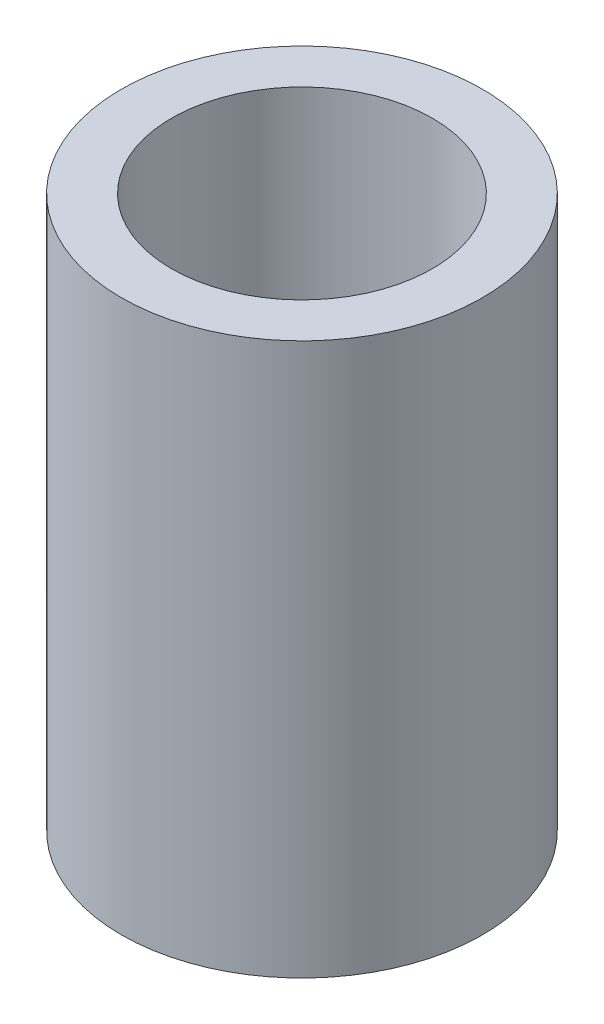
ISO-10303-21;
HEADER;
FILE_DESCRIPTION(('STEP AP214'),'2;1');
FILE_NAME('part.step','',(''),(''),'','','');
FILE_SCHEMA(('AUTOMOTIVE_DESIGN { 1 0 10303 214 1 1 1 1 }'));
ENDSEC;
DATA;
#1=APPLICATION_CONTEXT('core data for automotive mechanical design processes');
#2=APPLICATION_PROTOCOL_DEFINITION('international standard','automotive_design',2000,#1);
#3=PRODUCT_CONTEXT('',#1,'mechanical');
#4=PRODUCT('Part','Part','',(#3));
#5=PRODUCT_RELATED_PRODUCT_CATEGORY('part','',(#4));
#6=PRODUCT_DEFINITION_FORMATION('','',#4);
#7=PRODUCT_DEFINITION_CONTEXT('part definition',#1,'design');
#8=PRODUCT_DEFINITION('design','',#6,#7);
#9=PRODUCT_DEFINITION_SHAPE('','',#8);
#10=(LENGTH_UNIT() NAMED_UNIT(*) SI_UNIT(.MILLI.,.METRE.));
#11=(NAMED_UNIT(*) PLANE_ANGLE_UNIT() SI_UNIT($,.RADIAN.));
#12=(NAMED_UNIT(*) SI_UNIT($,.STERADIAN.) SOLID_ANGLE_UNIT());
#13=UNCERTAINTY_MEASURE_WITH_UNIT(LENGTH_MEASURE(1.E-05),#10,'distance_accuracy_value','');
#14=(GEOMETRIC_REPRESENTATION_CONTEXT(3) GLOBAL_UNCERTAINTY_ASSIGNED_CONTEXT((#13)) GLOBAL_UNIT_ASSIGNED_CONTEXT((#10,
#11,#12)) REPRESENTATION_CONTEXT('',''));
#15=CARTESIAN_POINT('',(0.,0.,0.));
#16=DIRECTION('',(0.,0.,1.));
#17=DIRECTION('',(1.,0.,0.));
#18=AXIS2_PLACEMENT_3D('',#15,#16,#17);
#19=CARTESIAN_POINT('',(0.,-15.,0.));
#20=DIRECTION('',(0.,1.,0.));
#21=DIRECTION('',(0.,0.,1.));
#22=AXIS2_PLACEMENT_3D('',#19,#20,#21);
#23=CYLINDRICAL_SURFACE('',#22,9.);
#24=CARTESIAN_POINT('',(0.,-15.,0.));
#25=DIRECTION('',(0.,1.,0.));
#26=DIRECTION('',(0.,0.,1.));
#27=AXIS2_PLACEMENT_3D('',#24,#25,#26);
#28=CIRCLE('',#27,9.);
#29=CARTESIAN_POINT('',(0.,-15.,9.));
#30=VERTEX_POINT('',#29);
#31=EDGE_CURVE('E10',#30,#30,#28,.T.);
#32=ORIENTED_EDGE('',*,*,#31,.T.);
#33=EDGE_LOOP('',(#32));
#34=FACE_BOUND('',#33,.T.);
#35=CARTESIAN_POINT('',(0.,12.5,0.));
#36=DIRECTION('',(0.,1.,0.));
#37=DIRECTION('',(0.,0.,1.));
#38=AXIS2_PLACEMENT_3D('',#35,#36,#37);
#39=CIRCLE('',#38,9.);
#40=CARTESIAN_POINT('',(0.,12.5,9.));
#41=VERTEX_POINT('',#40);
#42=EDGE_CURVE('E45',#41,#41,#39,.T.);
#43=ORIENTED_EDGE('',*,*,#42,.F.);
#44=EDGE_LOOP('',(#43));
#45=FACE_BOUND('',#44,.T.);
#46=ADVANCED_FACE('F35',(#34,#45),#23,.T.);
#47=CARTESIAN_POINT('',(0.,-15.,0.));
#48=DIRECTION('',(0.,1.,0.));
#49=DIRECTION('',(0.,0.,1.));
#50=AXIS2_PLACEMENT_3D('',#47,#48,#49);
#51=PLANE('',#50);
#52=CARTESIAN_POINT('',(0.,-15.,0.));
#53=DIRECTION('',(0.,1.,0.));
#54=DIRECTION('',(0.,0.,1.));
#55=AXIS2_PLACEMENT_3D('',#52,#53,#54);
#56=CIRCLE('',#55,6.5);
#57=CARTESIAN_POINT('',(0.,-15.,6.5));
#58=VERTEX_POINT('',#57);
#59=EDGE_CURVE('E41',#58,#58,#56,.T.);
#60=ORIENTED_EDGE('',*,*,#59,.T.);
#61=EDGE_LOOP('',(#60));
#62=FACE_BOUND('',#61,.T.);
#63=ORIENTED_EDGE('',*,*,#31,.F.);
#64=EDGE_LOOP('',(#63));
#65=FACE_BOUND('',#64,.T.);
#66=ADVANCED_FACE('F64',(#62,#65),#51,.F.);
#67=CARTESIAN_POINT('',(0.,-15.,0.));
#68=DIRECTION('',(0.,1.,0.));
#69=DIRECTION('',(0.,0.,1.));
#70=AXIS2_PLACEMENT_3D('',#67,#68,#69);
#71=CYLINDRICAL_SURFACE('',#70,6.5);
#72=ORIENTED_EDGE('',*,*,#59,.F.);
#73=EDGE_LOOP('',(#72));
#74=FACE_BOUND('',#73,.T.);
#75=CARTESIAN_POINT('',(0.,12.5,0.));
#76=DIRECTION('',(0.,1.,0.));
#77=DIRECTION('',(0.,0.,1.));
#78=AXIS2_PLACEMENT_3D('',#75,#76,#77);
#79=CIRCLE('',#78,6.5);
#80=CARTESIAN_POINT('',(0.,12.5,6.5));
#81=VERTEX_POINT('',#80);
#82=EDGE_CURVE('E49',#81,#81,#79,.T.);
#83=ORIENTED_EDGE('',*,*,#82,.T.);
#84=EDGE_LOOP('',(#83));
#85=FACE_BOUND('',#84,.T.);
#86=ADVANCED_FACE('F55',(#74,#85),#71,.F.);
#87=CARTESIAN_POINT('',(0.,12.5,0.));
#88=DIRECTION('',(0.,1.,0.));
#89=DIRECTION('',(0.,0.,1.));
#90=AXIS2_PLACEMENT_3D('',#87,#88,#89);
#91=PLANE('',#90);
#92=ORIENTED_EDGE('',*,*,#42,.T.);
#93=EDGE_LOOP('',(#92));
#94=FACE_BOUND('',#93,.T.);
#95=ORIENTED_EDGE('',*,*,#82,.F.);
#96=EDGE_LOOP('',(#95));
#97=FACE_BOUND('',#96,.T.);
#98=ADVANCED_FACE('F57',(#94,#97),#91,.T.);
#99=CLOSED_SHELL('',(#46,#66,#86,#98));
#100=MANIFOLD_SOLID_BREP('B2',#99);
#101=ADVANCED_BREP_SHAPE_REPRESENTATION('',(#18,#100),#14);
#102=SHAPE_DEFINITION_REPRESENTATION(#9,#101);
ENDSEC;
END-ISO-10303-21;
